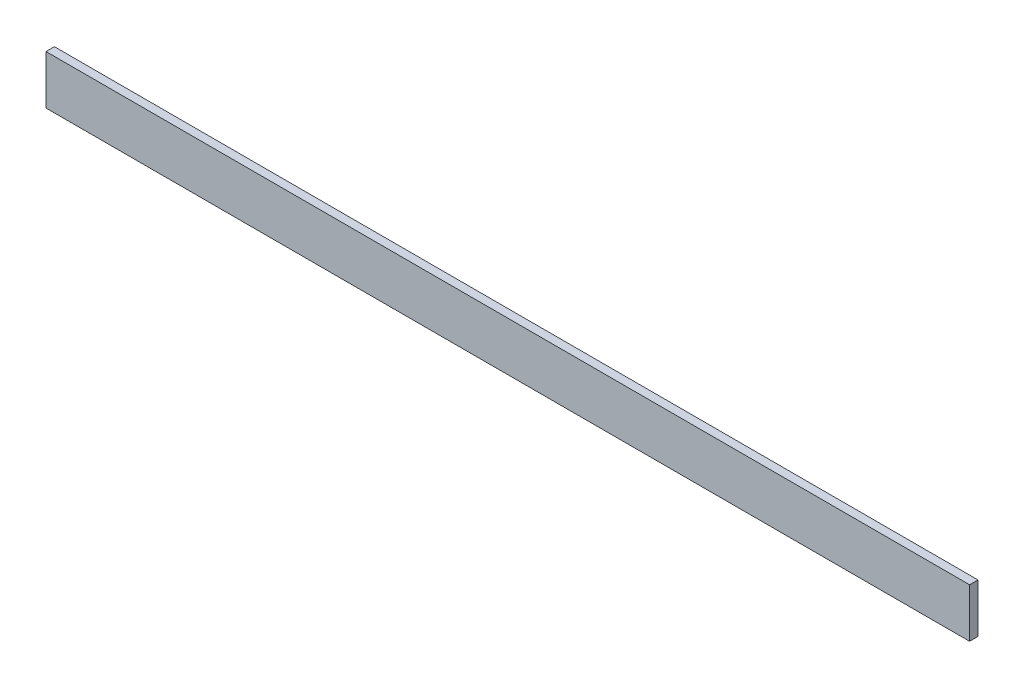
ISO-10303-21;
HEADER;
FILE_DESCRIPTION(('STEP AP214'),'2;1');
FILE_NAME('part.step','',(''),(''),'','','');
FILE_SCHEMA(('AUTOMOTIVE_DESIGN { 1 0 10303 214 1 1 1 1 }'));
ENDSEC;
DATA;
#1=APPLICATION_CONTEXT('core data for automotive mechanical design processes');
#2=APPLICATION_PROTOCOL_DEFINITION('international standard','automotive_design',2000,#1);
#3=PRODUCT_CONTEXT('',#1,'mechanical');
#4=PRODUCT('Part','Part','',(#3));
#5=PRODUCT_RELATED_PRODUCT_CATEGORY('part','',(#4));
#6=PRODUCT_DEFINITION_FORMATION('','',#4);
#7=PRODUCT_DEFINITION_CONTEXT('part definition',#1,'design');
#8=PRODUCT_DEFINITION('design','',#6,#7);
#9=PRODUCT_DEFINITION_SHAPE('','',#8);
#10=(LENGTH_UNIT() NAMED_UNIT(*) SI_UNIT(.MILLI.,.METRE.));
#11=(NAMED_UNIT(*) PLANE_ANGLE_UNIT() SI_UNIT($,.RADIAN.));
#12=(NAMED_UNIT(*) SI_UNIT($,.STERADIAN.) SOLID_ANGLE_UNIT());
#13=UNCERTAINTY_MEASURE_WITH_UNIT(LENGTH_MEASURE(1.E-05),#10,'distance_accuracy_value','');
#14=(GEOMETRIC_REPRESENTATION_CONTEXT(3) GLOBAL_UNCERTAINTY_ASSIGNED_CONTEXT((#13)) GLOBAL_UNIT_ASSIGNED_CONTEXT((#10,
#11,#12)) REPRESENTATION_CONTEXT('',''));
#15=CARTESIAN_POINT('',(0.,0.,0.));
#16=DIRECTION('',(0.,0.,1.));
#17=DIRECTION('',(1.,0.,0.));
#18=AXIS2_PLACEMENT_3D('',#15,#16,#17);
#19=CARTESIAN_POINT('',(-99.504132231405,9.17355371900826,6.));
#20=DIRECTION('',(1.,0.,0.));
#21=DIRECTION('',(0.,0.,-1.));
#22=AXIS2_PLACEMENT_3D('',#19,#20,#21);
#23=PLANE('',#22);
#24=DIRECTION('',(0.,-1.,0.));
#25=VECTOR('',#24,1.);
#26=CARTESIAN_POINT('',(-99.504132231405,9.17355371900826,0.));
#27=LINE('',#26,#25);
#28=CARTESIAN_POINT('',(-99.504132231405,9.17355371900826,0.));
#29=VERTEX_POINT('',#28);
#30=CARTESIAN_POINT('',(-99.504132231405,-25.8264462809917,0.));
#31=VERTEX_POINT('',#30);
#32=EDGE_CURVE('E107',#29,#31,#27,.T.);
#33=ORIENTED_EDGE('',*,*,#32,.T.);
#34=DIRECTION('',(0.,0.,-1.));
#35=VECTOR('',#34,1.);
#36=CARTESIAN_POINT('',(-99.504132231405,-25.8264462809917,6.));
#37=LINE('',#36,#35);
#38=CARTESIAN_POINT('',(-99.504132231405,-25.8264462809917,6.));
#39=VERTEX_POINT('',#38);
#40=EDGE_CURVE('E11',#39,#31,#37,.T.);
#41=ORIENTED_EDGE('',*,*,#40,.F.);
#42=DIRECTION('',(0.,-1.,0.));
#43=VECTOR('',#42,1.);
#44=CARTESIAN_POINT('',(-99.504132231405,9.17355371900826,6.));
#45=LINE('',#44,#43);
#46=CARTESIAN_POINT('',(-99.504132231405,9.17355371900826,6.));
#47=VERTEX_POINT('',#46);
#48=EDGE_CURVE('E91',#47,#39,#45,.T.);
#49=ORIENTED_EDGE('',*,*,#48,.F.);
#50=DIRECTION('',(0.,0.,-1.));
#51=VECTOR('',#50,1.);
#52=CARTESIAN_POINT('',(-99.504132231405,9.17355371900826,6.));
#53=LINE('',#52,#51);
#54=EDGE_CURVE('E103',#47,#29,#53,.T.);
#55=ORIENTED_EDGE('',*,*,#54,.T.);
#56=EDGE_LOOP('',(#33,#41,#49,#55));
#57=FACE_BOUND('',#56,.T.);
#58=ADVANCED_FACE('F39',(#57),#23,.F.);
#59=CARTESIAN_POINT('',(-99.504132231405,-25.8264462809917,6.));
#60=DIRECTION('',(0.,1.,0.));
#61=DIRECTION('',(0.,0.,1.));
#62=AXIS2_PLACEMENT_3D('',#59,#60,#61);
#63=PLANE('',#62);
#64=DIRECTION('',(1.,0.,0.));
#65=VECTOR('',#64,1.);
#66=CARTESIAN_POINT('',(-99.504132231405,-25.8264462809917,0.));
#67=LINE('',#66,#65);
#68=CARTESIAN_POINT('',(560.495867768595,-25.8264462809917,0.));
#69=VERTEX_POINT('',#68);
#70=EDGE_CURVE('E96',#31,#69,#67,.T.);
#71=ORIENTED_EDGE('',*,*,#70,.T.);
#72=DIRECTION('',(0.,0.,-1.));
#73=VECTOR('',#72,1.);
#74=CARTESIAN_POINT('',(560.495867768595,-25.8264462809917,6.));
#75=LINE('',#74,#73);
#76=CARTESIAN_POINT('',(560.495867768595,-25.8264462809917,6.));
#77=VERTEX_POINT('',#76);
#78=EDGE_CURVE('E48',#77,#69,#75,.T.);
#79=ORIENTED_EDGE('',*,*,#78,.F.);
#80=DIRECTION('',(1.,0.,0.));
#81=VECTOR('',#80,1.);
#82=CARTESIAN_POINT('',(-99.504132231405,-25.8264462809917,6.));
#83=LINE('',#82,#81);
#84=EDGE_CURVE('E86',#39,#77,#83,.T.);
#85=ORIENTED_EDGE('',*,*,#84,.F.);
#86=ORIENTED_EDGE('',*,*,#40,.T.);
#87=EDGE_LOOP('',(#71,#79,#85,#86));
#88=FACE_BOUND('',#87,.T.);
#89=ADVANCED_FACE('F95',(#88),#63,.F.);
#90=CARTESIAN_POINT('',(560.495867768595,9.17355371900826,6.));
#91=DIRECTION('',(-1.,0.,0.));
#92=DIRECTION('',(0.,0.,1.));
#93=AXIS2_PLACEMENT_3D('',#90,#91,#92);
#94=PLANE('',#93);
#95=DIRECTION('',(0.,1.,0.));
#96=VECTOR('',#95,1.);
#97=CARTESIAN_POINT('',(560.495867768595,9.17355371900826,0.));
#98=LINE('',#97,#96);
#99=CARTESIAN_POINT('',(560.495867768595,9.17355371900826,0.));
#100=VERTEX_POINT('',#99);
#101=EDGE_CURVE('E73',#69,#100,#98,.T.);
#102=ORIENTED_EDGE('',*,*,#101,.T.);
#103=DIRECTION('',(0.,0.,-1.));
#104=VECTOR('',#103,1.);
#105=CARTESIAN_POINT('',(560.495867768595,9.17355371900826,6.));
#106=LINE('',#105,#104);
#107=CARTESIAN_POINT('',(560.495867768595,9.17355371900826,6.));
#108=VERTEX_POINT('',#107);
#109=EDGE_CURVE('E98',#108,#100,#106,.T.);
#110=ORIENTED_EDGE('',*,*,#109,.F.);
#111=DIRECTION('',(0.,1.,0.));
#112=VECTOR('',#111,1.);
#113=CARTESIAN_POINT('',(560.495867768595,9.17355371900826,6.));
#114=LINE('',#113,#112);
#115=EDGE_CURVE('E89',#77,#108,#114,.T.);
#116=ORIENTED_EDGE('',*,*,#115,.F.);
#117=ORIENTED_EDGE('',*,*,#78,.T.);
#118=EDGE_LOOP('',(#102,#110,#116,#117));
#119=FACE_BOUND('',#118,.T.);
#120=ADVANCED_FACE('F99',(#119),#94,.F.);
#121=CARTESIAN_POINT('',(-99.504132231405,9.17355371900826,6.));
#122=DIRECTION('',(0.,-1.,0.));
#123=DIRECTION('',(0.,0.,-1.));
#124=AXIS2_PLACEMENT_3D('',#121,#122,#123);
#125=PLANE('',#124);
#126=DIRECTION('',(-1.,0.,0.));
#127=VECTOR('',#126,1.);
#128=CARTESIAN_POINT('',(-99.504132231405,9.17355371900826,0.));
#129=LINE('',#128,#127);
#130=EDGE_CURVE('E79',#100,#29,#129,.T.);
#131=ORIENTED_EDGE('',*,*,#130,.T.);
#132=ORIENTED_EDGE('',*,*,#54,.F.);
#133=DIRECTION('',(-1.,0.,0.));
#134=VECTOR('',#133,1.);
#135=CARTESIAN_POINT('',(-99.504132231405,9.17355371900826,6.));
#136=LINE('',#135,#134);
#137=EDGE_CURVE('E56',#108,#47,#136,.T.);
#138=ORIENTED_EDGE('',*,*,#137,.F.);
#139=ORIENTED_EDGE('',*,*,#109,.T.);
#140=EDGE_LOOP('',(#131,#132,#138,#139));
#141=FACE_BOUND('',#140,.T.);
#142=ADVANCED_FACE('F120',(#141),#125,.F.);
#143=CARTESIAN_POINT('',(0.,0.,6.));
#144=DIRECTION('',(0.,0.,1.));
#145=DIRECTION('',(1.,0.,0.));
#146=AXIS2_PLACEMENT_3D('',#143,#144,#145);
#147=PLANE('',#146);
#148=ORIENTED_EDGE('',*,*,#48,.T.);
#149=ORIENTED_EDGE('',*,*,#84,.T.);
#150=ORIENTED_EDGE('',*,*,#115,.T.);
#151=ORIENTED_EDGE('',*,*,#137,.T.);
#152=EDGE_LOOP('',(#148,#149,#150,#151));
#153=FACE_BOUND('',#152,.T.);
#154=ADVANCED_FACE('F87',(#153),#147,.T.);
#155=CARTESIAN_POINT('',(0.,0.,0.));
#156=DIRECTION('',(0.,0.,1.));
#157=DIRECTION('',(1.,0.,0.));
#158=AXIS2_PLACEMENT_3D('',#155,#156,#157);
#159=PLANE('',#158);
#160=ORIENTED_EDGE('',*,*,#32,.F.);
#161=ORIENTED_EDGE('',*,*,#130,.F.);
#162=ORIENTED_EDGE('',*,*,#101,.F.);
#163=ORIENTED_EDGE('',*,*,#70,.F.);
#164=EDGE_LOOP('',(#160,#161,#162,#163));
#165=FACE_BOUND('',#164,.T.);
#166=ADVANCED_FACE('F123',(#165),#159,.F.);
#167=CLOSED_SHELL('',(#58,#89,#120,#142,#154,#166));
#168=MANIFOLD_SOLID_BREP('B2',#167);
#169=ADVANCED_BREP_SHAPE_REPRESENTATION('',(#18,#168),#14);
#170=SHAPE_DEFINITION_REPRESENTATION(#9,#169);
ENDSEC;
END-ISO-10303-21;
